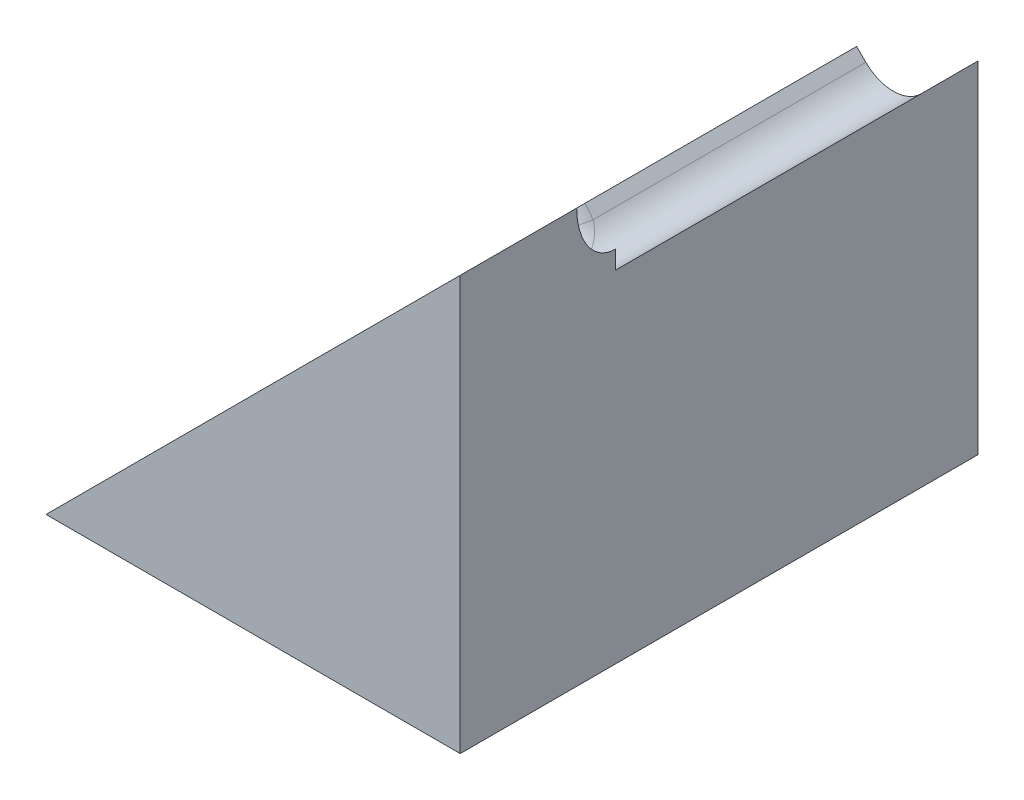
ISO-10303-21;
HEADER;
FILE_DESCRIPTION(('STEP AP214'),'2;1');
FILE_NAME('part.step','',(''),(''),'','','');
FILE_SCHEMA(('AUTOMOTIVE_DESIGN { 1 0 10303 214 1 1 1 1 }'));
ENDSEC;
DATA;
#1=APPLICATION_CONTEXT('core data for automotive mechanical design processes');
#2=APPLICATION_PROTOCOL_DEFINITION('international standard','automotive_design',2000,#1);
#3=PRODUCT_CONTEXT('',#1,'mechanical');
#4=PRODUCT('Part','Part','',(#3));
#5=PRODUCT_RELATED_PRODUCT_CATEGORY('part','',(#4));
#6=PRODUCT_DEFINITION_FORMATION('','',#4);
#7=PRODUCT_DEFINITION_CONTEXT('part definition',#1,'design');
#8=PRODUCT_DEFINITION('design','',#6,#7);
#9=PRODUCT_DEFINITION_SHAPE('','',#8);
#10=(LENGTH_UNIT() NAMED_UNIT(*) SI_UNIT(.MILLI.,.METRE.));
#11=(NAMED_UNIT(*) PLANE_ANGLE_UNIT() SI_UNIT($,.RADIAN.));
#12=(NAMED_UNIT(*) SI_UNIT($,.STERADIAN.) SOLID_ANGLE_UNIT());
#13=UNCERTAINTY_MEASURE_WITH_UNIT(LENGTH_MEASURE(1.E-05),#10,'distance_accuracy_value','');
#14=(GEOMETRIC_REPRESENTATION_CONTEXT(3) GLOBAL_UNCERTAINTY_ASSIGNED_CONTEXT((#13)) GLOBAL_UNIT_ASSIGNED_CONTEXT((#10,
#11,#12)) REPRESENTATION_CONTEXT('',''));
#15=CARTESIAN_POINT('',(0.,0.,0.));
#16=DIRECTION('',(0.,0.,1.));
#17=DIRECTION('',(1.,0.,0.));
#18=AXIS2_PLACEMENT_3D('',#15,#16,#17);
#19=CARTESIAN_POINT('',(0.,0.,5.));
#20=DIRECTION('',(0.707106781186544,-0.707106781186551,0.));
#21=DIRECTION('',(0.707106781186551,0.707106781186544,0.));
#22=AXIS2_PLACEMENT_3D('',#19,#20,#21);
#23=PLANE('',#22);
#24=DIRECTION('',(0.707106781186551,0.707106781186544,0.));
#25=VECTOR('',#24,1.);
#26=CARTESIAN_POINT('',(0.,0.,3.125));
#27=LINE('',#26,#25);
#28=CARTESIAN_POINT('',(0.,0.,3.125));
#29=VERTEX_POINT('',#28);
#30=CARTESIAN_POINT('',(2.47487373415293,2.4748737341529,3.125));
#31=VERTEX_POINT('',#30);
#32=EDGE_CURVE('E164',#29,#31,#27,.T.);
#33=ORIENTED_EDGE('',*,*,#32,.T.);
#34=CARTESIAN_POINT('',(2.47487373415293,2.4748737341529,2.625));
#35=DIRECTION('',(0.707106781186544,-0.707106781186551,0.));
#36=DIRECTION('',(0.707106781186551,0.707106781186544,0.));
#37=AXIS2_PLACEMENT_3D('',#34,#35,#36);
#38=CIRCLE('',#37,0.5);
#39=CARTESIAN_POINT('',(2.8284271247462,2.82842712474618,2.625));
#40=VERTEX_POINT('',#39);
#41=EDGE_CURVE('E134',#31,#40,#38,.F.);
#42=ORIENTED_EDGE('',*,*,#41,.T.);
#43=DIRECTION('',(0.,0.,1.));
#44=VECTOR('',#43,1.);
#45=CARTESIAN_POINT('',(2.8284271247462,2.82842712474618,0.));
#46=LINE('',#45,#44);
#47=CARTESIAN_POINT('',(2.8284271247462,2.82842712474618,0.));
#48=VERTEX_POINT('',#47);
#49=EDGE_CURVE('E121',#48,#40,#46,.T.);
#50=ORIENTED_EDGE('',*,*,#49,.F.);
#51=DIRECTION('',(-0.707106781186551,-0.707106781186544,0.));
#52=VECTOR('',#51,1.);
#53=CARTESIAN_POINT('',(0.,0.,0.));
#54=LINE('',#53,#52);
#55=CARTESIAN_POINT('',(0.,0.,0.));
#56=VERTEX_POINT('',#55);
#57=EDGE_CURVE('E132',#48,#56,#54,.T.);
#58=ORIENTED_EDGE('',*,*,#57,.T.);
#59=DIRECTION('',(0.,0.,-1.));
#60=VECTOR('',#59,1.);
#61=CARTESIAN_POINT('',(0.,0.,5.));
#62=LINE('',#61,#60);
#63=EDGE_CURVE('E155',#29,#56,#62,.T.);
#64=ORIENTED_EDGE('',*,*,#63,.F.);
#65=EDGE_LOOP('',(#33,#42,#50,#58,#64));
#66=FACE_BOUND('',#65,.T.);
#67=ADVANCED_FACE('F35',(#66),#23,.F.);
#68=CARTESIAN_POINT('',(4.,0.,5.));
#69=DIRECTION('',(0.,1.,0.));
#70=DIRECTION('',(-1.,0.,0.));
#71=AXIS2_PLACEMENT_3D('',#68,#69,#70);
#72=PLANE('',#71);
#73=CARTESIAN_POINT('',(0.,0.,5.));
#74=VERTEX_POINT('',#73);
#75=CARTESIAN_POINT('',(0.,0.,3.875));
#76=VERTEX_POINT('',#75);
#77=EDGE_CURVE('E151',#74,#76,#62,.T.);
#78=ORIENTED_EDGE('',*,*,#77,.T.);
#79=CARTESIAN_POINT('',(0.,0.,3.5));
#80=DIRECTION('',(0.,1.,0.));
#81=DIRECTION('',(1.,0.,0.));
#82=AXIS2_PLACEMENT_3D('',#79,#80,#81);
#83=ELLIPSE('',#82,0.530330085889913,0.375);
#84=EDGE_CURVE('E244',#76,#29,#83,.T.);
#85=ORIENTED_EDGE('',*,*,#84,.T.);
#86=ORIENTED_EDGE('',*,*,#63,.T.);
#87=DIRECTION('',(1.,0.,0.));
#88=VECTOR('',#87,1.);
#89=CARTESIAN_POINT('',(4.,0.,0.));
#90=LINE('',#89,#88);
#91=CARTESIAN_POINT('',(4.,0.,0.));
#92=VERTEX_POINT('',#91);
#93=EDGE_CURVE('E140',#56,#92,#90,.T.);
#94=ORIENTED_EDGE('',*,*,#93,.T.);
#95=DIRECTION('',(0.,0.,-1.));
#96=VECTOR('',#95,1.);
#97=CARTESIAN_POINT('',(4.,0.,5.));
#98=LINE('',#97,#96);
#99=CARTESIAN_POINT('',(4.,0.,5.));
#100=VERTEX_POINT('',#99);
#101=EDGE_CURVE('E158',#100,#92,#98,.T.);
#102=ORIENTED_EDGE('',*,*,#101,.F.);
#103=DIRECTION('',(1.,0.,0.));
#104=VECTOR('',#103,1.);
#105=CARTESIAN_POINT('',(4.,0.,5.));
#106=LINE('',#105,#104);
#107=EDGE_CURVE('E141',#74,#100,#106,.T.);
#108=ORIENTED_EDGE('',*,*,#107,.F.);
#109=EDGE_LOOP('',(#78,#85,#86,#94,#102,#108));
#110=FACE_BOUND('',#109,.T.);
#111=ADVANCED_FACE('F214',(#110),#72,.F.);
#112=CARTESIAN_POINT('',(4.,3.99999999999996,5.));
#113=DIRECTION('',(-1.,0.,0.));
#114=DIRECTION('',(0.,-1.,0.));
#115=AXIS2_PLACEMENT_3D('',#112,#113,#114);
#116=PLANE('',#115);
#117=DIRECTION('',(0.,0.,-1.));
#118=VECTOR('',#117,1.);
#119=CARTESIAN_POINT('',(4.,3.29289321881342,5.));
#120=LINE('',#119,#118);
#121=CARTESIAN_POINT('',(4.,3.29289321881342,3.5));
#122=VERTEX_POINT('',#121);
#123=CARTESIAN_POINT('',(4.,3.29289321881342,0.));
#124=VERTEX_POINT('',#123);
#125=EDGE_CURVE('E245',#122,#124,#120,.T.);
#126=ORIENTED_EDGE('',*,*,#125,.F.);
#127=DIRECTION('',(0.,1.,0.));
#128=VECTOR('',#127,1.);
#129=CARTESIAN_POINT('',(4.,3.99999999999996,3.5));
#130=LINE('',#129,#128);
#131=CARTESIAN_POINT('',(4.,3.46966991411005,3.5));
#132=VERTEX_POINT('',#131);
#133=EDGE_CURVE('E126',#122,#132,#130,.T.);
#134=ORIENTED_EDGE('',*,*,#133,.T.);
#135=CARTESIAN_POINT('',(4.,3.99999999999996,3.5));
#136=DIRECTION('',(-1.,0.,0.));
#137=DIRECTION('',(0.,1.,0.));
#138=AXIS2_PLACEMENT_3D('',#135,#136,#137);
#139=ELLIPSE('',#138,0.530330085889907,0.375);
#140=CARTESIAN_POINT('',(4.,3.99999999999996,3.875));
#141=VERTEX_POINT('',#140);
#142=EDGE_CURVE('E241',#132,#141,#139,.T.);
#143=ORIENTED_EDGE('',*,*,#142,.T.);
#144=DIRECTION('',(0.,0.,-1.));
#145=VECTOR('',#144,1.);
#146=CARTESIAN_POINT('',(4.,3.99999999999996,5.));
#147=LINE('',#146,#145);
#148=CARTESIAN_POINT('',(4.,3.99999999999996,5.));
#149=VERTEX_POINT('',#148);
#150=EDGE_CURVE('E154',#149,#141,#147,.T.);
#151=ORIENTED_EDGE('',*,*,#150,.F.);
#152=DIRECTION('',(0.,1.,0.));
#153=VECTOR('',#152,1.);
#154=CARTESIAN_POINT('',(4.,3.99999999999996,5.));
#155=LINE('',#154,#153);
#156=EDGE_CURVE('E145',#100,#149,#155,.T.);
#157=ORIENTED_EDGE('',*,*,#156,.F.);
#158=ORIENTED_EDGE('',*,*,#101,.T.);
#159=DIRECTION('',(0.,1.,0.));
#160=VECTOR('',#159,1.);
#161=CARTESIAN_POINT('',(4.,3.99999999999996,0.));
#162=LINE('',#161,#160);
#163=EDGE_CURVE('E142',#92,#124,#162,.T.);
#164=ORIENTED_EDGE('',*,*,#163,.T.);
#165=EDGE_LOOP('',(#126,#134,#143,#151,#157,#158,#164));
#166=FACE_BOUND('',#165,.T.);
#167=ADVANCED_FACE('F220',(#166),#116,.F.);
#168=ORIENTED_EDGE('',*,*,#150,.T.);
#169=DIRECTION('',(0.707106781186551,0.707106781186544,0.));
#170=VECTOR('',#169,1.);
#171=CARTESIAN_POINT('',(0.,0.,3.875));
#172=LINE('',#171,#170);
#173=EDGE_CURVE('E161',#141,#76,#172,.F.);
#174=ORIENTED_EDGE('',*,*,#173,.T.);
#175=ORIENTED_EDGE('',*,*,#77,.F.);
#176=DIRECTION('',(-0.707106781186551,-0.707106781186544,0.));
#177=VECTOR('',#176,1.);
#178=CARTESIAN_POINT('',(0.,0.,5.));
#179=LINE('',#178,#177);
#180=EDGE_CURVE('E237',#149,#74,#179,.T.);
#181=ORIENTED_EDGE('',*,*,#180,.F.);
#182=EDGE_LOOP('',(#168,#174,#175,#181));
#183=FACE_BOUND('',#182,.T.);
#184=ADVANCED_FACE('F216',(#183),#23,.F.);
#185=CARTESIAN_POINT('',(0.,0.,5.));
#186=DIRECTION('',(0.,0.,1.));
#187=DIRECTION('',(1.,0.,0.));
#188=AXIS2_PLACEMENT_3D('',#185,#186,#187);
#189=PLANE('',#188);
#190=ORIENTED_EDGE('',*,*,#107,.T.);
#191=ORIENTED_EDGE('',*,*,#156,.T.);
#192=ORIENTED_EDGE('',*,*,#180,.T.);
#193=EDGE_LOOP('',(#190,#191,#192));
#194=FACE_BOUND('',#193,.T.);
#195=ADVANCED_FACE('F225',(#194),#189,.T.);
#196=CARTESIAN_POINT('',(0.,0.,0.));
#197=DIRECTION('',(0.,0.,1.));
#198=DIRECTION('',(1.,0.,0.));
#199=AXIS2_PLACEMENT_3D('',#196,#197,#198);
#200=PLANE('',#199);
#201=ORIENTED_EDGE('',*,*,#57,.F.);
#202=DIRECTION('',(-0.707106781186544,0.707106781186551,0.));
#203=VECTOR('',#202,1.);
#204=CARTESIAN_POINT('',(3.18198051533948,2.4748737341529,0.));
#205=LINE('',#204,#203);
#206=CARTESIAN_POINT('',(2.91681547239452,2.74003877709786,0.));
#207=VERTEX_POINT('',#206);
#208=EDGE_CURVE('E118',#207,#48,#205,.T.);
#209=ORIENTED_EDGE('',*,*,#208,.F.);
#210=CARTESIAN_POINT('',(3.18198051533948,3.00520382004281,0.));
#211=DIRECTION('',(0.,0.,1.));
#212=DIRECTION('',(1.,0.,0.));
#213=AXIS2_PLACEMENT_3D('',#210,#211,#212);
#214=CIRCLE('',#213,0.375);
#215=CARTESIAN_POINT('',(3.44714555828443,2.74003877709785,0.));
#216=VERTEX_POINT('',#215);
#217=EDGE_CURVE('E177',#207,#216,#214,.T.);
#218=ORIENTED_EDGE('',*,*,#217,.T.);
#219=DIRECTION('',(-0.707106781186551,-0.707106781186544,0.));
#220=VECTOR('',#219,1.);
#221=CARTESIAN_POINT('',(0.353553390593272,-0.353553390593276,0.));
#222=LINE('',#221,#220);
#223=EDGE_CURVE('E168',#124,#216,#222,.T.);
#224=ORIENTED_EDGE('',*,*,#223,.F.);
#225=ORIENTED_EDGE('',*,*,#163,.F.);
#226=ORIENTED_EDGE('',*,*,#93,.F.);
#227=EDGE_LOOP('',(#201,#209,#218,#224,#225,#226));
#228=FACE_BOUND('',#227,.T.);
#229=ADVANCED_FACE('F138',(#228),#200,.F.);
#230=CARTESIAN_POINT('',(0.,0.,3.5));
#231=DIRECTION('',(0.707106781186551,0.707106781186544,0.));
#232=DIRECTION('',(-0.707106781186544,0.707106781186551,0.));
#233=AXIS2_PLACEMENT_3D('',#230,#231,#232);
#234=CYLINDRICAL_SURFACE('',#233,0.375);
#235=CARTESIAN_POINT('',(2.46872350581007,2.5133043777855,3.12632731846313));
#236=CARTESIAN_POINT('',(2.88477876248048,2.77301934183633,3.11700125997096));
#237=CARTESIAN_POINT('',(2.86356154783389,2.80712716535409,2.62809707641397));
#238=CARTESIAN_POINT('',(2.47319255054957,2.4980541728136,3.12513310330378));
#239=CARTESIAN_POINT('',(2.88488375536559,2.77615858041523,3.12156327692102));
#240=CARTESIAN_POINT('',(2.87111092410249,2.7949572918882,2.62531057335452));
#241=CARTESIAN_POINT('',(2.47919336831246,2.48397532558196,3.12473907147333));
#242=CARTESIAN_POINT('',(2.88276563025021,2.77995875995496,3.12483627906037));
#243=CARTESIAN_POINT('',(2.8794197502878,2.78318645307677,2.62439116564789));
#244=CARTESIAN_POINT('',(2.49396788875503,2.45846130647995,3.12557564515594));
#245=CARTESIAN_POINT('',(2.87594716094056,2.78658880052478,3.12879354363533));
#246=CARTESIAN_POINT('',(2.89726269890449,2.76074086215822,2.62634317131539));
#247=CARTESIAN_POINT('',(2.50273222529112,2.44701742756562,3.12680080700057));
#248=CARTESIAN_POINT('',(2.87127629298066,2.78939063818815,3.12946144826401));
#249=CARTESIAN_POINT('',(2.90679261896023,2.75006256677503,2.62920188279447));
#250=CARTESIAN_POINT('',(2.52501499753694,2.42472979833151,3.13134852410376));
#251=CARTESIAN_POINT('',(2.86026606608267,2.79195185003738,3.12809816300049));
#252=CARTESIAN_POINT('',(2.92907677890448,2.7277763252493,2.63981322316185));
#253=CARTESIAN_POINT('',(2.53915803775586,2.41459088098951,3.13507839131953));
#254=CARTESIAN_POINT('',(2.85385474459562,2.79090941699332,3.12546334551794));
#255=CARTESIAN_POINT('',(2.94207578402584,2.71649337280469,2.64851624646732));
#256=CARTESIAN_POINT('',(2.57035012185186,2.39857361314774,3.14478952528894));
#257=CARTESIAN_POINT('',(2.84473922410971,2.7828112699524,3.11917758957077));
#258=CARTESIAN_POINT('',(2.96893220632841,2.69614044316865,2.67117555895238));
#259=CARTESIAN_POINT('',(2.58740222355134,2.39269978033944,3.15077316914751));
#260=CARTESIAN_POINT('',(2.84201878658114,2.77589420611883,3.11557421303159));
#261=CARTESIAN_POINT('',(2.98279051689944,2.68707281923614,2.68513739471044));
#262=CARTESIAN_POINT('',(2.62332098291511,2.38489389388043,3.16461057464279));
#263=CARTESIAN_POINT('',(2.84261295783071,2.75809843923641,3.11058468325211));
#264=CARTESIAN_POINT('',(3.01067702690156,2.67123468340788,2.71742467413388));
#265=CARTESIAN_POINT('',(2.64217115700374,2.3829290740471,3.17244816934332));
#266=CARTESIAN_POINT('',(2.84573026743964,2.74740430412006,3.10914251599322));
#267=CARTESIAN_POINT('',(3.02470281411586,2.66444547668855,2.73571239495016));
#268=CARTESIAN_POINT('',(2.68098911360552,2.38229421348299,3.18970140767444));
#269=CARTESIAN_POINT('',(2.85773948553159,2.72481073175947,3.11032652209307));
#270=CARTESIAN_POINT('',(3.05261131470905,2.6529011601182,2.77596995104089));
#271=CARTESIAN_POINT('',(2.70095766779542,2.3836264757918,3.19911815007033));
#272=CARTESIAN_POINT('',(2.86646250773701,2.71297116506242,3.11284262995262));
#273=CARTESIAN_POINT('',(3.06649392127422,2.64814747481632,2.79794235010121));
#274=CARTESIAN_POINT('',(2.75008903687294,2.39015350590116,3.22364435027628));
#275=CARTESIAN_POINT('',(2.89287919791749,2.68552010038941,3.124654217315));
#276=CARTESIAN_POINT('',(3.09972289052558,2.63877210509721,2.85517015073485));
#277=CARTESIAN_POINT('',(2.77947943066559,2.39677417101992,3.23945027911533));
#278=CARTESIAN_POINT('',(2.91275548275437,2.67019621936718,3.13620040048047));
#279=CARTESIAN_POINT('',(3.11882441037005,2.6351038962356,2.89205065129792));
#280=CARTESIAN_POINT('',(2.83737641285539,2.41376851032976,3.27328229074941));
#281=CARTESIAN_POINT('',(2.9565045739619,2.64480890992817,3.16843498260315));
#282=CARTESIAN_POINT('',(3.15532387214728,2.63070071520003,2.97099201171977));
#283=CARTESIAN_POINT('',(2.8658816275054,2.4241477296194,3.29131162774726));
#284=CARTESIAN_POINT('',(2.98033660600999,2.63451482033983,3.18888538922124));
#285=CARTESIAN_POINT('',(3.17271924851814,2.62997009631009,3.01306046471856));
#286=CARTESIAN_POINT('',(2.91471447027433,2.44442972156746,3.32576550828919));
#287=CARTESIAN_POINT('',(3.02285866199139,2.62091392456735,3.23287401835868));
#288=CARTESIAN_POINT('',(3.20180499565856,2.63050499238936,3.09345285269493));
#289=CARTESIAN_POINT('',(2.93555066188978,2.45402812591152,3.34181346074331));
#290=CARTESIAN_POINT('',(3.04164341702192,2.61654363863577,3.25488441301749));
#291=CARTESIAN_POINT('',(3.21394558843929,2.63140779764105,3.13089807512176));
#292=CARTESIAN_POINT('',(2.96411127088535,2.46809092932624,3.36700205882247));
#293=CARTESIAN_POINT('',(3.06776510765891,2.61212613604718,3.29139936176661));
#294=CARTESIAN_POINT('',(3.2303280795838,2.63329248375141,3.18967147055882));
#295=CARTESIAN_POINT('',(2.97317335122651,2.47271742987393,3.375573523153));
#296=CARTESIAN_POINT('',(3.07608867085796,2.61100723234378,3.30406236213899));
#297=CARTESIAN_POINT('',(3.2354791368014,2.63400796151236,3.20967155394787));
#298=CARTESIAN_POINT('',(2.99010403844751,2.48159482243227,3.39313731531141));
#299=CARTESIAN_POINT('',(3.09168550830414,2.60932850572487,3.33049036237969));
#300=CARTESIAN_POINT('',(3.24503608694314,2.63551161697401,3.25065373565359));
#301=CARTESIAN_POINT('',(2.99797083786715,2.48584514162227,3.40213025413231));
#302=CARTESIAN_POINT('',(3.09897641708498,2.60876409876219,3.34426788985379));
#303=CARTESIAN_POINT('',(3.24944085248736,2.63629990193332,3.27163725962078));
#304=CARTESIAN_POINT('',(3.01356260058951,2.49443870826813,3.42246725679988));
#305=CARTESIAN_POINT('',(3.11342625943902,2.60795103816301,3.37582041390211));
#306=CARTESIAN_POINT('',(3.25812252111636,2.63798337416312,3.31909026589211));
#307=CARTESIAN_POINT('',(3.02091299350301,2.49861508285865,3.43390935204449));
#308=CARTESIAN_POINT('',(3.12027996440164,2.60778796853984,3.39387978563493));
#309=CARTESIAN_POINT('',(3.26217955188111,2.63886638673424,3.3457884881107));
#310=CARTESIAN_POINT('',(3.03232291631669,2.50517984260514,3.45729352412761));
#311=CARTESIAN_POINT('',(3.13089829895895,2.60768367283476,3.43111628706712));
#312=CARTESIAN_POINT('',(3.2684538511027,2.64029552298307,3.4003515562909));
#313=CARTESIAN_POINT('',(3.03639193093062,2.50757337945126,3.46923405426355));
#314=CARTESIAN_POINT('',(3.13470029891857,2.60774065898261,3.45033580904655));
#315=CARTESIAN_POINT('',(3.2706764224436,2.6408426165217,3.42821279327976));
#316=CARTESIAN_POINT('',(3.04053799927407,2.5100128059263,3.49341068674894));
#317=CARTESIAN_POINT('',(3.13856199773107,2.60779983004993,3.48932301928723));
#318=CARTESIAN_POINT('',(3.27294092083984,2.64140047302409,3.48462493574938));
#319=CARTESIAN_POINT('',(3.04059323422423,2.51004586405062,3.50564804291287));
#320=CARTESIAN_POINT('',(3.13861340446513,2.60780189764183,3.50915378369528));
#321=CARTESIAN_POINT('',(3.27297092919696,2.64140830456462,3.51317876679719));
#322=CARTESIAN_POINT('',(3.03662388513788,2.507709398512,3.52999320989628));
#323=CARTESIAN_POINT('',(3.1349166964618,2.60774287590354,3.54842184152091));
#324=CARTESIAN_POINT('',(3.27080324143176,2.64087350035419,3.56998415642414));
#325=CARTESIAN_POINT('',(3.03256869834039,2.50532185303038,3.54209936069678));
#326=CARTESIAN_POINT('',(3.13112822809437,2.60768111959318,3.56791691889877));
#327=CARTESIAN_POINT('',(3.26858883528551,2.64032673552153,3.59823184162565));
#328=CARTESIAN_POINT('',(3.01941291668426,2.49775134899734,3.56929585401643));
#329=CARTESIAN_POINT('',(3.11887383916778,2.60780239754979,3.6112551813213));
#330=CARTESIAN_POINT('',(3.26135484954065,2.63867802739731,3.66169032603856));
#331=CARTESIAN_POINT('',(3.00916765384559,2.4919467266714,3.58419838957997));
#332=CARTESIAN_POINT('',(3.10930184679684,2.60806632372499,3.63471325077288));
#333=CARTESIAN_POINT('',(3.25569526817758,2.63745908654764,3.69646290902005));
#334=CARTESIAN_POINT('',(2.98510014117104,2.47889185002221,3.61276958370131));
#335=CARTESIAN_POINT('',(3.08703579340827,2.60968051290289,3.67864906516649));
#336=CARTESIAN_POINT('',(3.24223415245265,2.63501060684936,3.76312902863632));
#337=CARTESIAN_POINT('',(2.97132935305191,2.47166271250836,3.62645246327871));
#338=CARTESIAN_POINT('',(3.0743087235264,2.61103008751887,3.69922469550566));
#339=CARTESIAN_POINT('',(3.23446334308579,2.6337814480884,3.79505574765015));
#340=CARTESIAN_POINT('',(2.95664000657549,2.4644148262708,3.63957860128624));
#341=CARTESIAN_POINT('',(3.06100287558428,2.61327455980019,3.71803789576195));
#342=CARTESIAN_POINT('',(3.22604177738481,2.63280134262493,3.82568340300124));
#343=(BOUNDED_SURFACE() B_SPLINE_SURFACE(3,2,((#235,#236,#237),(#238,#239,#240),(#241,#242,
#243),(#244,#245,#246),(#247,#248,#249),(#250,#251,#252),(#253,#254,#255),(#256,#257,#258),
(#259,#260,#261),(#262,#263,#264),(#265,#266,#267),(#268,#269,#270),(#271,#272,#273),(#274,#275,
#276),(#277,#278,#279),(#280,#281,#282),(#283,#284,#285),(#286,#287,#288),(#289,#290,#291),
(#292,#293,#294),(#295,#296,#297),(#298,#299,#300),(#301,#302,#303),(#304,#305,#306),(#307,#308,
#309),(#310,#311,#312),(#313,#314,#315),(#316,#317,#318),(#319,#320,#321),(#322,#323,#324),
(#325,#326,#327),(#328,#329,#330),(#331,#332,#333),(#334,#335,#336),(#337,#338,#339),(#340,#341,
#342)),.UNSPECIFIED.,.F.,.F.,.F.) B_SPLINE_SURFACE_WITH_KNOTS((4,2,2,2,2,2,2,2,2,2,2,2,2,2,2,2,
2,4),(3,3),(0.,0.100467290824239,0.200597672122839,0.323090663176724,0.445713213557646,
0.56730351067011,0.6889787635957,0.86348398875276,1.03824772222409,1.17880529585295,
1.24891763839375,1.31913496910883,1.4040542487979,1.48872718341844,1.57386036319406,
1.65963206292298,1.77100465228378,1.88083602439864),(0.,1.),
.UNSPECIFIED.) GEOMETRIC_REPRESENTATION_ITEM() RATIONAL_B_SPLINE_SURFACE(((1.,0.713819105925202,
1.),(1.,0.709694510605038,1.),(1.,0.70706015381209,1.),(1.,0.704818599768802,1.),(1.,
0.705201280790497,1.),(1.,0.709437846343191,1.),(1.,0.714047884251036,1.),(1.,0.726888055969943,
1.),(1.,0.735122013554564,1.),(1.,0.753783421553199,1.),(1.,0.764191823347453,1.),(1.,
0.78600727928554,1.),(1.,0.797415026112021,1.),(1.,0.825215268124361,1.),(1.,0.841621500187321,
1.),(1.,0.872614852397593,1.),(1.,0.887199241748164,1.),(1.,0.910863663082549,1.),(1.,
0.920462331986197,1.),(1.,0.933041677767431,1.),(1.,0.93692814033966,1.),(1.,0.944031114735285,
1.),(1.,0.947246614641196,1.),(1.,0.953498294714228,1.),(1.,0.956355964832793,1.),(1.,
0.960730740540675,1.),(1.,0.962251710968275,1.),(1.,0.963800948691456,1.),(1.,0.963821057366019,
1.),(1.,0.962338836748894,1.),(1.,0.96082508766385,1.),(1.,0.9557805690646,1.),(1.,
0.95178262287872,1.),(1.,0.94198932980466,1.),(1.,0.936219621657842,1.),(1.,0.929749251020707,1.))) REPRESENTATION_ITEM('') SURFACE());
#344=CARTESIAN_POINT('',(2.95664000657549,2.4644148262708,3.63957860128624));
#345=CARTESIAN_POINT('',(2.97132935305192,2.47166271250836,3.62645246327871));
#346=CARTESIAN_POINT('',(2.98510014117104,2.47889185002221,3.61276958370131));
#347=CARTESIAN_POINT('',(3.00916765384558,2.4919467266714,3.58419838957997));
#348=CARTESIAN_POINT('',(3.01941291668426,2.49775134899733,3.56929585401643));
#349=CARTESIAN_POINT('',(3.03256869834039,2.50532185303038,3.54209936069678));
#350=CARTESIAN_POINT('',(3.03662388513788,2.507709398512,3.52999320989628));
#351=CARTESIAN_POINT('',(3.04059323422423,2.51004586405062,3.50564804291287));
#352=CARTESIAN_POINT('',(3.04053799927407,2.5100128059263,3.49341068674894));
#353=CARTESIAN_POINT('',(3.03639193093062,2.50757337945126,3.46923405426355));
#354=CARTESIAN_POINT('',(3.03232291631669,2.50517984260514,3.45729352412761));
#355=CARTESIAN_POINT('',(3.02091299350301,2.49861508285865,3.43390935204449));
#356=CARTESIAN_POINT('',(3.01356260058951,2.49443870826813,3.42246725679988));
#357=CARTESIAN_POINT('',(2.99797083786715,2.48584514162227,3.40213025413231));
#358=CARTESIAN_POINT('',(2.99010403844751,2.48159482243227,3.39313731531141));
#359=CARTESIAN_POINT('',(2.97317335122651,2.47271742987393,3.375573523153));
#360=CARTESIAN_POINT('',(2.96411127088535,2.46809092932624,3.36700205882247));
#361=CARTESIAN_POINT('',(2.93555066188978,2.45402812591152,3.34181346074331));
#362=CARTESIAN_POINT('',(2.91471447027433,2.44442972156746,3.32576550828919));
#363=CARTESIAN_POINT('',(2.8658816275054,2.4241477296194,3.29131162774726));
#364=CARTESIAN_POINT('',(2.83737641285539,2.41376851032976,3.27328229074941));
#365=CARTESIAN_POINT('',(2.77947943066559,2.39677417101992,3.23945027911533));
#366=CARTESIAN_POINT('',(2.75008903687294,2.39015350590116,3.22364435027628));
#367=CARTESIAN_POINT('',(2.70095766779542,2.3836264757918,3.19911815007033));
#368=CARTESIAN_POINT('',(2.68098911360552,2.38229421348299,3.18970140767444));
#369=CARTESIAN_POINT('',(2.64217115700374,2.3829290740471,3.17244816934332));
#370=CARTESIAN_POINT('',(2.62332098291511,2.38489389388043,3.16461057464279));
#371=CARTESIAN_POINT('',(2.58740222355133,2.39269978033944,3.15077316914751));
#372=CARTESIAN_POINT('',(2.57035012185186,2.39857361314774,3.14478952528894));
#373=CARTESIAN_POINT('',(2.53915803775586,2.41459088098951,3.13507839131953));
#374=CARTESIAN_POINT('',(2.52501499753694,2.42472979833151,3.13134852410376));
#375=CARTESIAN_POINT('',(2.50273222529112,2.44701742756562,3.12680080700057));
#376=CARTESIAN_POINT('',(2.49396788875503,2.45846130647995,3.12557564515594));
#377=CARTESIAN_POINT('',(2.47919336831246,2.48397532558196,3.12473907147333));
#378=CARTESIAN_POINT('',(2.47319255054957,2.4980541728136,3.12513310330378));
#379=CARTESIAN_POINT('',(2.46872350581007,2.5133043777855,3.12632731846313));
#380=B_SPLINE_CURVE_WITH_KNOTS('',3,(#344,#345,#346,#347,#348,#349,#350,#351,#352,#353,#354,
#355,#356,#357,#358,#359,#360,#361,#362,#363,#364,#365,#366,#367,#368,#369,#370,#371,#372,#373,
#374,#375,#376,#377,#378,#379),.UNSPECIFIED.,.F.,.F.,(4,2,2,2,2,2,2,2,2,2,2,2,2,2,2,2,2,4),(0.,
0.109831372114857,0.221203961475664,0.30697566120458,0.392108840980194,0.476781775600735,
0.561701055289813,0.631918386004886,0.702030728545692,0.842588302174552,1.01735203564588,
1.19185726080294,1.31353251372853,1.43512281084099,1.55774536122191,1.6802383522758,
1.7803687335744,1.88083602439864),.UNSPECIFIED.);
#381=CARTESIAN_POINT('',(3.04006849103657,2.50973840514663,3.5));
#382=VERTEX_POINT('',#381);
#383=CARTESIAN_POINT('',(2.51275445457364,2.43699301373219,3.12884625552096));
#384=VERTEX_POINT('',#383);
#385=EDGE_CURVE('E179',#382,#384,#380,.T.);
#386=ORIENTED_EDGE('',*,*,#385,.T.);
#387=CARTESIAN_POINT('',(2.47487373415293,2.4748737341529,3.5));
#388=DIRECTION('',(-0.707106781186551,-0.707106781186544,0.));
#389=DIRECTION('',(0.707106781186544,-0.707106781186551,0.));
#390=AXIS2_PLACEMENT_3D('',#387,#388,#389);
#391=CIRCLE('',#390,0.375);
#392=EDGE_CURVE('E186',#384,#31,#391,.F.);
#393=ORIENTED_EDGE('',*,*,#392,.T.);
#394=ORIENTED_EDGE('',*,*,#32,.F.);
#395=ORIENTED_EDGE('',*,*,#84,.F.);
#396=ORIENTED_EDGE('',*,*,#173,.F.);
#397=ORIENTED_EDGE('',*,*,#142,.F.);
#398=DIRECTION('',(0.707106781186551,0.707106781186544,0.));
#399=VECTOR('',#398,1.);
#400=CARTESIAN_POINT('',(0.265165042944954,-0.265165042944957,3.5));
#401=LINE('',#400,#399);
#402=EDGE_CURVE('E166',#132,#382,#401,.F.);
#403=ORIENTED_EDGE('',*,*,#402,.T.);
#404=EDGE_LOOP('',(#386,#393,#394,#395,#396,#397,#403));
#405=FACE_BOUND('',#404,.T.);
#406=ADVANCED_FACE('F188',(#405),#234,.F.);
#407=CARTESIAN_POINT('',(0.353553390593272,-0.353553390593276,0.));
#408=DIRECTION('',(-0.707106781186544,0.707106781186551,0.));
#409=DIRECTION('',(-0.707106781186551,-0.707106781186544,0.));
#410=AXIS2_PLACEMENT_3D('',#407,#408,#409);
#411=PLANE('',#410);
#412=ORIENTED_EDGE('',*,*,#223,.T.);
#413=DIRECTION('',(0.,0.,1.));
#414=VECTOR('',#413,1.);
#415=CARTESIAN_POINT('',(3.44714555828443,2.74003877709785,0.));
#416=LINE('',#415,#414);
#417=CARTESIAN_POINT('',(3.44714555828443,2.74003877709785,3.5));
#418=VERTEX_POINT('',#417);
#419=EDGE_CURVE('E171',#216,#418,#416,.T.);
#420=ORIENTED_EDGE('',*,*,#419,.T.);
#421=DIRECTION('',(0.707106781186551,0.707106781186544,0.));
#422=VECTOR('',#421,1.);
#423=CARTESIAN_POINT('',(4.35355339059327,3.64644660940668,3.5));
#424=LINE('',#423,#422);
#425=EDGE_CURVE('E127',#418,#122,#424,.T.);
#426=ORIENTED_EDGE('',*,*,#425,.T.);
#427=ORIENTED_EDGE('',*,*,#125,.T.);
#428=EDGE_LOOP('',(#412,#420,#426,#427));
#429=FACE_BOUND('',#428,.T.);
#430=ADVANCED_FACE('F258',(#429),#411,.T.);
#431=CARTESIAN_POINT('',(4.35355339059327,3.64644660940668,3.5));
#432=DIRECTION('',(0.,0.,1.));
#433=DIRECTION('',(1.,0.,0.));
#434=AXIS2_PLACEMENT_3D('',#431,#432,#433);
#435=PLANE('',#434);
#436=ORIENTED_EDGE('',*,*,#425,.F.);
#437=CARTESIAN_POINT('',(3.18198051533948,3.00520382004281,3.5));
#438=DIRECTION('',(0.,0.,1.));
#439=DIRECTION('',(1.,0.,0.));
#440=AXIS2_PLACEMENT_3D('',#437,#438,#439);
#441=CIRCLE('',#440,0.375);
#442=CARTESIAN_POINT('',(3.27268395803535,2.64133861769018,3.5));
#443=VERTEX_POINT('',#442);
#444=EDGE_CURVE('E174',#418,#443,#441,.F.);
#445=ORIENTED_EDGE('',*,*,#444,.T.);
#446=CARTESIAN_POINT('',(3.39362188162984,2.15618501455335,3.5));
#447=DIRECTION('',(0.,0.,1.));
#448=DIRECTION('',(1.,0.,0.));
#449=AXIS2_PLACEMENT_3D('',#446,#447,#448);
#450=CIRCLE('',#449,0.5);
#451=EDGE_CURVE('E11',#443,#382,#450,.T.);
#452=ORIENTED_EDGE('',*,*,#451,.T.);
#453=ORIENTED_EDGE('',*,*,#402,.F.);
#454=ORIENTED_EDGE('',*,*,#133,.F.);
#455=EDGE_LOOP('',(#436,#445,#452,#453,#454));
#456=FACE_BOUND('',#455,.T.);
#457=ADVANCED_FACE('F262',(#456),#435,.F.);
#458=CARTESIAN_POINT('',(3.18198051533948,2.4748737341529,0.));
#459=DIRECTION('',(-0.707106781186551,-0.707106781186544,0.));
#460=DIRECTION('',(0.707106781186544,-0.707106781186551,0.));
#461=AXIS2_PLACEMENT_3D('',#458,#459,#460);
#462=PLANE('',#461);
#463=ORIENTED_EDGE('',*,*,#49,.T.);
#464=CARTESIAN_POINT('',(2.82842712474621,2.82842712474617,3.5));
#465=DIRECTION('',(-0.707106781186551,-0.707106781186544,0.));
#466=DIRECTION('',(0.707106781186544,-0.707106781186551,0.));
#467=AXIS2_PLACEMENT_3D('',#464,#465,#466);
#468=CIRCLE('',#467,0.875);
#469=CARTESIAN_POINT('',(2.91681547239452,2.74003877709786,2.63397459621556));
#470=VERTEX_POINT('',#469);
#471=EDGE_CURVE('E62',#40,#470,#468,.T.);
#472=ORIENTED_EDGE('',*,*,#471,.T.);
#473=DIRECTION('',(0.,0.,1.));
#474=VECTOR('',#473,1.);
#475=CARTESIAN_POINT('',(2.91681547239452,2.74003877709786,0.));
#476=LINE('',#475,#474);
#477=EDGE_CURVE('E122',#470,#207,#476,.F.);
#478=ORIENTED_EDGE('',*,*,#477,.T.);
#479=ORIENTED_EDGE('',*,*,#208,.T.);
#480=EDGE_LOOP('',(#463,#472,#478,#479));
#481=FACE_BOUND('',#480,.T.);
#482=ADVANCED_FACE('F120',(#481),#462,.F.);
#483=CARTESIAN_POINT('',(3.18198051533948,3.00520382004281,0.));
#484=DIRECTION('',(0.,0.,1.));
#485=DIRECTION('',(1.,0.,0.));
#486=AXIS2_PLACEMENT_3D('',#483,#484,#485);
#487=CYLINDRICAL_SURFACE('',#486,0.375);
#488=ORIENTED_EDGE('',*,*,#477,.F.);
#489=CARTESIAN_POINT('',(2.86356154783389,2.80712716535409,2.62809707641397));
#490=CARTESIAN_POINT('',(2.87111092410249,2.7949572918882,2.62531057335452));
#491=CARTESIAN_POINT('',(2.8794197502878,2.78318645307677,2.62439116564789));
#492=CARTESIAN_POINT('',(2.89726269890449,2.76074086215822,2.62634317131539));
#493=CARTESIAN_POINT('',(2.90679261896023,2.75006256677503,2.62920188279447));
#494=CARTESIAN_POINT('',(2.92907677890448,2.7277763252493,2.63981322316185));
#495=CARTESIAN_POINT('',(2.94207578402584,2.71649337280469,2.64851624646732));
#496=CARTESIAN_POINT('',(2.96893220632841,2.69614044316865,2.67117555895238));
#497=CARTESIAN_POINT('',(2.98279051689944,2.68707281923614,2.68513739471044));
#498=CARTESIAN_POINT('',(3.01067702690156,2.67123468340788,2.71742467413388));
#499=CARTESIAN_POINT('',(3.02470281411586,2.66444547668855,2.73571239495016));
#500=CARTESIAN_POINT('',(3.05261131470905,2.6529011601182,2.77596995104089));
#501=CARTESIAN_POINT('',(3.06649392127422,2.64814747481632,2.79794235010121));
#502=CARTESIAN_POINT('',(3.09972289052558,2.63877210509721,2.85517015073485));
#503=CARTESIAN_POINT('',(3.11882441037005,2.6351038962356,2.89205065129792));
#504=CARTESIAN_POINT('',(3.15532387214728,2.63070071520003,2.97099201171977));
#505=CARTESIAN_POINT('',(3.17271924851814,2.62997009631009,3.01306046471856));
#506=CARTESIAN_POINT('',(3.20180499565856,2.63050499238936,3.09345285269493));
#507=CARTESIAN_POINT('',(3.21394558843929,2.63140779764105,3.13089807512176));
#508=CARTESIAN_POINT('',(3.2303280795838,2.63329248375141,3.18967147055882));
#509=CARTESIAN_POINT('',(3.2354791368014,2.63400796151236,3.20967155394787));
#510=CARTESIAN_POINT('',(3.24503608694314,2.63551161697401,3.25065373565359));
#511=CARTESIAN_POINT('',(3.24944085248736,2.63629990193332,3.27163725962078));
#512=CARTESIAN_POINT('',(3.25812252111636,2.63798337416312,3.31909026589211));
#513=CARTESIAN_POINT('',(3.26217955188111,2.63886638673424,3.3457884881107));
#514=CARTESIAN_POINT('',(3.2684538511027,2.64029552298307,3.4003515562909));
#515=CARTESIAN_POINT('',(3.2706764224436,2.6408426165217,3.42821279327976));
#516=CARTESIAN_POINT('',(3.27294092083984,2.64140047302409,3.48462493574938));
#517=CARTESIAN_POINT('',(3.27297092919696,2.64140830456462,3.51317876679719));
#518=CARTESIAN_POINT('',(3.27080324143176,2.64087350035419,3.56998415642414));
#519=CARTESIAN_POINT('',(3.26858883528551,2.64032673552153,3.59823184162565));
#520=CARTESIAN_POINT('',(3.26135484954065,2.63867802739731,3.66169032603856));
#521=CARTESIAN_POINT('',(3.25569526817758,2.63745908654764,3.69646290902005));
#522=CARTESIAN_POINT('',(3.24223415245265,2.63501060684936,3.76312902863632));
#523=CARTESIAN_POINT('',(3.23446334308579,2.6337814480884,3.79505574765015));
#524=CARTESIAN_POINT('',(3.22604177738481,2.63280134262493,3.82568340300124));
#525=B_SPLINE_CURVE_WITH_KNOTS('',3,(#489,#490,#491,#492,#493,#494,#495,#496,#497,#498,#499,
#500,#501,#502,#503,#504,#505,#506,#507,#508,#509,#510,#511,#512,#513,#514,#515,#516,#517,#518,
#519,#520,#521,#522,#523,#524),.UNSPECIFIED.,.F.,.F.,(4,2,2,2,2,2,2,2,2,2,2,2,2,2,2,2,2,4),(0.,
0.100467290824239,0.200597672122839,0.323090663176724,0.445713213557646,0.56730351067011,
0.6889787635957,0.86348398875276,1.03824772222409,1.17880529585295,1.24891763839375,
1.31913496910883,1.4040542487979,1.48872718341844,1.57386036319406,1.65963206292298,
1.77100465228378,1.88083602439864),.UNSPECIFIED.);
#526=EDGE_CURVE('E47',#470,#443,#525,.T.);
#527=ORIENTED_EDGE('',*,*,#526,.T.);
#528=ORIENTED_EDGE('',*,*,#444,.F.);
#529=ORIENTED_EDGE('',*,*,#419,.F.);
#530=ORIENTED_EDGE('',*,*,#217,.F.);
#531=EDGE_LOOP('',(#488,#527,#528,#529,#530));
#532=FACE_BOUND('',#531,.T.);
#533=ADVANCED_FACE('F196',(#532),#487,.F.);
#534=ORIENTED_EDGE('',*,*,#451,.F.);
#535=ORIENTED_EDGE('',*,*,#526,.F.);
#536=CARTESIAN_POINT('',(2.56326208180125,2.38648538650458,2.63397459621556));
#537=DIRECTION('',(-0.699854212223761,0.699854212223768,-0.142857142857145));
#538=DIRECTION('',(-0.707106781186551,-0.707106781186544,0.));
#539=AXIS2_PLACEMENT_3D('',#536,#537,#538);
#540=CIRCLE('',#539,0.5);
#541=EDGE_CURVE('E135',#384,#470,#540,.T.);
#542=ORIENTED_EDGE('',*,*,#541,.F.);
#543=ORIENTED_EDGE('',*,*,#385,.F.);
#544=EDGE_LOOP('',(#534,#535,#542,#543));
#545=FACE_BOUND('',#544,.T.);
#546=ADVANCED_FACE('F201',(#545),#343,.T.);
#547=CARTESIAN_POINT('',(2.47487373415293,2.4748737341529,3.5));
#548=DIRECTION('',(-0.707106781186551,-0.707106781186544,0.));
#549=DIRECTION('',(0.707106781186544,-0.707106781186551,0.));
#550=AXIS2_PLACEMENT_3D('',#547,#548,#549);
#551=TOROIDAL_SURFACE('',#550,0.875,0.5);
#552=ORIENTED_EDGE('',*,*,#541,.T.);
#553=ORIENTED_EDGE('',*,*,#471,.F.);
#554=ORIENTED_EDGE('',*,*,#41,.F.);
#555=ORIENTED_EDGE('',*,*,#392,.F.);
#556=EDGE_LOOP('',(#552,#553,#554,#555));
#557=FACE_BOUND('',#556,.T.);
#558=ADVANCED_FACE('F204',(#557),#551,.T.);
#559=CLOSED_SHELL('',(#67,#111,#167,#184,#195,#229,#406,#430,#457,#482,#533,#546,#558));
#560=MANIFOLD_SOLID_BREP('B2',#559);
#561=ADVANCED_BREP_SHAPE_REPRESENTATION('',(#18,#560),#14);
#562=SHAPE_DEFINITION_REPRESENTATION(#9,#561);
ENDSEC;
END-ISO-10303-21;
